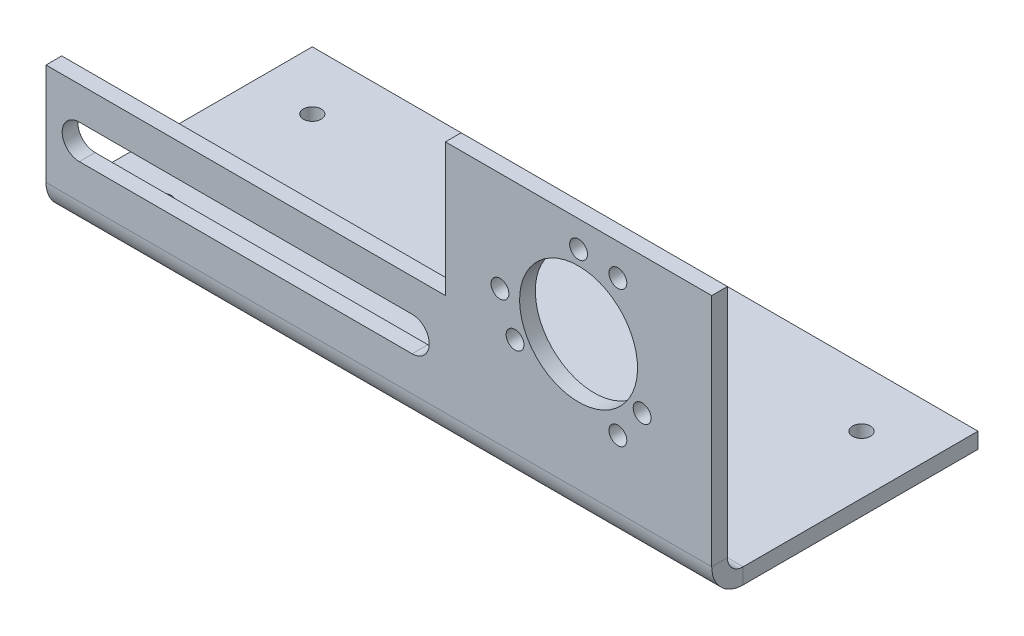
ISO-10303-21;
HEADER;
FILE_DESCRIPTION(('STEP AP214'),'2;1');
FILE_NAME('part.step','',(''),(''),'','','');
FILE_SCHEMA(('AUTOMOTIVE_DESIGN { 1 0 10303 214 1 1 1 1 }'));
ENDSEC;
DATA;
#1=APPLICATION_CONTEXT('core data for automotive mechanical design processes');
#2=APPLICATION_PROTOCOL_DEFINITION('international standard','automotive_design',2000,#1);
#3=PRODUCT_CONTEXT('',#1,'mechanical');
#4=PRODUCT('Part','Part','',(#3));
#5=PRODUCT_RELATED_PRODUCT_CATEGORY('part','',(#4));
#6=PRODUCT_DEFINITION_FORMATION('','',#4);
#7=PRODUCT_DEFINITION_CONTEXT('part definition',#1,'design');
#8=PRODUCT_DEFINITION('design','',#6,#7);
#9=PRODUCT_DEFINITION_SHAPE('','',#8);
#10=(LENGTH_UNIT() NAMED_UNIT(*) SI_UNIT(.MILLI.,.METRE.));
#11=(NAMED_UNIT(*) PLANE_ANGLE_UNIT() SI_UNIT($,.RADIAN.));
#12=(NAMED_UNIT(*) SI_UNIT($,.STERADIAN.) SOLID_ANGLE_UNIT());
#13=UNCERTAINTY_MEASURE_WITH_UNIT(LENGTH_MEASURE(1.E-05),#10,'distance_accuracy_value','');
#14=(GEOMETRIC_REPRESENTATION_CONTEXT(3) GLOBAL_UNCERTAINTY_ASSIGNED_CONTEXT((#13)) GLOBAL_UNIT_ASSIGNED_CONTEXT((#10,
#11,#12)) REPRESENTATION_CONTEXT('',''));
#15=CARTESIAN_POINT('',(0.,0.,0.));
#16=DIRECTION('',(0.,0.,1.));
#17=DIRECTION('',(1.,0.,0.));
#18=AXIS2_PLACEMENT_3D('',#15,#16,#17);
#19=CARTESIAN_POINT('',(0.,0.,0.));
#20=DIRECTION('',(1.,0.,0.));
#21=DIRECTION('',(0.,0.,-1.));
#22=AXIS2_PLACEMENT_3D('',#19,#20,#21);
#23=PLANE('',#22);
#24=DIRECTION('',(0.,-1.,0.));
#25=VECTOR('',#24,1.);
#26=CARTESIAN_POINT('',(0.,0.,0.));
#27=LINE('',#26,#25);
#28=CARTESIAN_POINT('',(0.,22.4,3.26561694352634E-13));
#29=VERTEX_POINT('',#28);
#30=CARTESIAN_POINT('',(0.,2.99999999999999,0.));
#31=VERTEX_POINT('',#30);
#32=EDGE_CURVE('E161',#29,#31,#27,.T.);
#33=ORIENTED_EDGE('',*,*,#32,.F.);
#34=DIRECTION('',(0.,0.,-1.));
#35=VECTOR('',#34,1.);
#36=CARTESIAN_POINT('',(0.,22.4,3.26561694352634E-13));
#37=LINE('',#36,#35);
#38=CARTESIAN_POINT('',(0.,22.4,-3.00000000000002));
#39=VERTEX_POINT('',#38);
#40=EDGE_CURVE('E337',#29,#39,#37,.T.);
#41=ORIENTED_EDGE('',*,*,#40,.T.);
#42=DIRECTION('',(0.,1.,0.));
#43=VECTOR('',#42,1.);
#44=CARTESIAN_POINT('',(0.,0.,-3.00000000000001));
#45=LINE('',#44,#43);
#46=CARTESIAN_POINT('',(0.,3.00000000000003,-3.00000000000001));
#47=VERTEX_POINT('',#46);
#48=EDGE_CURVE('E81',#39,#47,#45,.F.);
#49=ORIENTED_EDGE('',*,*,#48,.T.);
#50=DIRECTION('',(0.,0.,1.));
#51=VECTOR('',#50,1.);
#52=CARTESIAN_POINT('',(0.,3.00000000000003,0.));
#53=LINE('',#52,#51);
#54=EDGE_CURVE('E159',#47,#31,#53,.T.);
#55=ORIENTED_EDGE('',*,*,#54,.T.);
#56=EDGE_LOOP('',(#33,#41,#49,#55));
#57=FACE_BOUND('',#56,.T.);
#58=ADVANCED_FACE('F59',(#57),#23,.F.);
#59=CARTESIAN_POINT('',(127.,47.8000000000001,0.));
#60=DIRECTION('',(-1.,0.,0.));
#61=DIRECTION('',(0.,0.,1.));
#62=AXIS2_PLACEMENT_3D('',#59,#60,#61);
#63=PLANE('',#62);
#64=DIRECTION('',(0.,0.,1.));
#65=VECTOR('',#64,1.);
#66=CARTESIAN_POINT('',(127.,3.00000000000003,-3.));
#67=LINE('',#66,#65);
#68=CARTESIAN_POINT('',(127.,3.00000000000003,-3.00000000000001));
#69=VERTEX_POINT('',#68);
#70=CARTESIAN_POINT('',(127.,3.00000000000003,0.));
#71=VERTEX_POINT('',#70);
#72=EDGE_CURVE('E13',#69,#71,#67,.T.);
#73=ORIENTED_EDGE('',*,*,#72,.F.);
#74=DIRECTION('',(0.,-1.,0.));
#75=VECTOR('',#74,1.);
#76=CARTESIAN_POINT('',(127.,47.8000000000001,-3.00000000000001));
#77=LINE('',#76,#75);
#78=CARTESIAN_POINT('',(127.,47.8000000000001,-3.00000000000001));
#79=VERTEX_POINT('',#78);
#80=EDGE_CURVE('E73',#69,#79,#77,.F.);
#81=ORIENTED_EDGE('',*,*,#80,.T.);
#82=DIRECTION('',(0.,0.,-1.));
#83=VECTOR('',#82,1.);
#84=CARTESIAN_POINT('',(127.,47.8000000000001,0.));
#85=LINE('',#84,#83);
#86=CARTESIAN_POINT('',(127.,47.8000000000001,0.));
#87=VERTEX_POINT('',#86);
#88=EDGE_CURVE('E187',#87,#79,#85,.T.);
#89=ORIENTED_EDGE('',*,*,#88,.F.);
#90=DIRECTION('',(0.,1.,0.));
#91=VECTOR('',#90,1.);
#92=CARTESIAN_POINT('',(127.,0.,0.));
#93=LINE('',#92,#91);
#94=EDGE_CURVE('E176',#71,#87,#93,.T.);
#95=ORIENTED_EDGE('',*,*,#94,.F.);
#96=EDGE_LOOP('',(#73,#81,#89,#95));
#97=FACE_BOUND('',#96,.T.);
#98=ADVANCED_FACE('F386',(#97),#63,.F.);
#99=CARTESIAN_POINT('',(0.,0.,0.));
#100=DIRECTION('',(0.,0.,-1.));
#101=DIRECTION('',(-1.,0.,0.));
#102=AXIS2_PLACEMENT_3D('',#99,#100,#101);
#103=PLANE('',#102);
#104=CARTESIAN_POINT('',(101.6,42.75,0.));
#105=DIRECTION('',(0.,0.,-1.));
#106=DIRECTION('',(0.,1.,0.));
#107=AXIS2_PLACEMENT_3D('',#104,#105,#106);
#108=CIRCLE('',#107,1.69999999999999);
#109=CARTESIAN_POINT('',(101.6,44.45,0.));
#110=VERTEX_POINT('',#109);
#111=EDGE_CURVE('E257',#110,#110,#108,.T.);
#112=ORIENTED_EDGE('',*,*,#111,.T.);
#113=EDGE_LOOP('',(#112));
#114=FACE_BOUND('',#113,.T.);
#115=CARTESIAN_POINT('',(109.1,41.7403810567667,0.));
#116=DIRECTION('',(0.,0.,-1.));
#117=DIRECTION('',(0.,1.,0.));
#118=AXIS2_PLACEMENT_3D('',#115,#116,#117);
#119=CIRCLE('',#118,1.69999999999999);
#120=CARTESIAN_POINT('',(109.1,43.4403810567667,0.));
#121=VERTEX_POINT('',#120);
#122=EDGE_CURVE('E263',#121,#121,#119,.T.);
#123=ORIENTED_EDGE('',*,*,#122,.T.);
#124=EDGE_LOOP('',(#123));
#125=FACE_BOUND('',#124,.T.);
#126=CARTESIAN_POINT('',(89.4756443470179,21.75,0.));
#127=DIRECTION('',(0.,0.,-1.));
#128=DIRECTION('',(0.,1.,0.));
#129=AXIS2_PLACEMENT_3D('',#126,#127,#128);
#130=CIRCLE('',#129,1.69999999999999);
#131=CARTESIAN_POINT('',(89.4756443470179,23.45,0.));
#132=VERTEX_POINT('',#131);
#133=EDGE_CURVE('E269',#132,#132,#130,.T.);
#134=ORIENTED_EDGE('',*,*,#133,.T.);
#135=EDGE_LOOP('',(#134));
#136=FACE_BOUND('',#135,.T.);
#137=CARTESIAN_POINT('',(86.6,28.7500000000001,0.));
#138=DIRECTION('',(0.,0.,-1.));
#139=DIRECTION('',(0.,1.,0.));
#140=AXIS2_PLACEMENT_3D('',#137,#138,#139);
#141=CIRCLE('',#140,1.69999999999999);
#142=CARTESIAN_POINT('',(86.6,30.4500000000001,0.));
#143=VERTEX_POINT('',#142);
#144=EDGE_CURVE('E275',#143,#143,#141,.T.);
#145=ORIENTED_EDGE('',*,*,#144,.T.);
#146=EDGE_LOOP('',(#145));
#147=FACE_BOUND('',#146,.T.);
#148=CARTESIAN_POINT('',(113.724355652982,21.7500000000002,0.));
#149=DIRECTION('',(0.,0.,-1.));
#150=DIRECTION('',(0.,1.,0.));
#151=AXIS2_PLACEMENT_3D('',#148,#149,#150);
#152=CIRCLE('',#151,1.69999999999999);
#153=CARTESIAN_POINT('',(113.724355652982,23.4500000000002,0.));
#154=VERTEX_POINT('',#153);
#155=EDGE_CURVE('E281',#154,#154,#152,.T.);
#156=ORIENTED_EDGE('',*,*,#155,.T.);
#157=EDGE_LOOP('',(#156));
#158=FACE_BOUND('',#157,.T.);
#159=CARTESIAN_POINT('',(109.1,15.7596189432335,0.));
#160=DIRECTION('',(0.,0.,-1.));
#161=DIRECTION('',(0.,1.,0.));
#162=AXIS2_PLACEMENT_3D('',#159,#160,#161);
#163=CIRCLE('',#162,1.69999999999999);
#164=CARTESIAN_POINT('',(109.1,17.4596189432335,0.));
#165=VERTEX_POINT('',#164);
#166=EDGE_CURVE('E287',#165,#165,#163,.T.);
#167=ORIENTED_EDGE('',*,*,#166,.T.);
#168=EDGE_LOOP('',(#167));
#169=FACE_BOUND('',#168,.T.);
#170=CARTESIAN_POINT('',(101.6,28.75,3.26561694352634E-13));
#171=DIRECTION('',(0.,0.,-1.));
#172=DIRECTION('',(0.,1.,0.));
#173=AXIS2_PLACEMENT_3D('',#170,#171,#172);
#174=CIRCLE('',#173,11.25);
#175=CARTESIAN_POINT('',(101.6,40.,3.26561694352634E-13));
#176=VERTEX_POINT('',#175);
#177=EDGE_CURVE('E308',#176,#176,#174,.T.);
#178=ORIENTED_EDGE('',*,*,#177,.T.);
#179=EDGE_LOOP('',(#178));
#180=FACE_BOUND('',#179,.T.);
#181=DIRECTION('',(-1.,0.,0.));
#182=VECTOR('',#181,1.);
#183=CARTESIAN_POINT('',(6.35,9.61110000000005,3.26561694352634E-13));
#184=LINE('',#183,#182);
#185=CARTESIAN_POINT('',(69.85,9.61110000000005,3.26561694352634E-13));
#186=VERTEX_POINT('',#185);
#187=CARTESIAN_POINT('',(6.35,9.61110000000005,3.26561694352634E-13));
#188=VERTEX_POINT('',#187);
#189=EDGE_CURVE('E301',#186,#188,#184,.T.);
#190=ORIENTED_EDGE('',*,*,#189,.T.);
#191=CARTESIAN_POINT('',(6.35,12.875,3.26561694352634E-13));
#192=DIRECTION('',(0.,0.,-1.));
#193=DIRECTION('',(0.,1.,0.));
#194=AXIS2_PLACEMENT_3D('',#191,#192,#193);
#195=CIRCLE('',#194,3.2639);
#196=CARTESIAN_POINT('',(6.35,16.1389,3.26561694352634E-13));
#197=VERTEX_POINT('',#196);
#198=EDGE_CURVE('E291',#188,#197,#195,.T.);
#199=ORIENTED_EDGE('',*,*,#198,.T.);
#200=DIRECTION('',(1.,0.,0.));
#201=VECTOR('',#200,1.);
#202=CARTESIAN_POINT('',(6.35,16.1389,3.26561694352634E-13));
#203=LINE('',#202,#201);
#204=CARTESIAN_POINT('',(69.85,16.1389,0.));
#205=VERTEX_POINT('',#204);
#206=EDGE_CURVE('E294',#197,#205,#203,.T.);
#207=ORIENTED_EDGE('',*,*,#206,.T.);
#208=CARTESIAN_POINT('',(69.85,12.875,3.26561694352634E-13));
#209=DIRECTION('',(0.,0.,-1.));
#210=DIRECTION('',(0.,1.,0.));
#211=AXIS2_PLACEMENT_3D('',#208,#209,#210);
#212=CIRCLE('',#211,3.2639);
#213=EDGE_CURVE('E298',#205,#186,#212,.T.);
#214=ORIENTED_EDGE('',*,*,#213,.T.);
#215=EDGE_LOOP('',(#190,#199,#207,#214));
#216=FACE_BOUND('',#215,.T.);
#217=DIRECTION('',(0.,-1.,0.));
#218=VECTOR('',#217,1.);
#219=CARTESIAN_POINT('',(76.2,47.8000000000001,3.26561694352634E-13));
#220=LINE('',#219,#218);
#221=CARTESIAN_POINT('',(76.2,47.8000000000001,0.));
#222=VERTEX_POINT('',#221);
#223=CARTESIAN_POINT('',(76.2,22.4,3.26561694352634E-13));
#224=VERTEX_POINT('',#223);
#225=EDGE_CURVE('E329',#222,#224,#220,.T.);
#226=ORIENTED_EDGE('',*,*,#225,.T.);
#227=DIRECTION('',(-1.,0.,0.));
#228=VECTOR('',#227,1.);
#229=CARTESIAN_POINT('',(0.,22.4,3.26561694352634E-13));
#230=LINE('',#229,#228);
#231=EDGE_CURVE('E175',#224,#29,#230,.T.);
#232=ORIENTED_EDGE('',*,*,#231,.T.);
#233=ORIENTED_EDGE('',*,*,#32,.T.);
#234=DIRECTION('',(-1.,0.,0.));
#235=VECTOR('',#234,1.);
#236=CARTESIAN_POINT('',(0.,3.00000000000003,0.));
#237=LINE('',#236,#235);
#238=EDGE_CURVE('E166',#71,#31,#237,.T.);
#239=ORIENTED_EDGE('',*,*,#238,.F.);
#240=ORIENTED_EDGE('',*,*,#94,.T.);
#241=DIRECTION('',(-1.,0.,0.));
#242=VECTOR('',#241,1.);
#243=CARTESIAN_POINT('',(0.,47.8000000000001,0.));
#244=LINE('',#243,#242);
#245=EDGE_CURVE('E344',#87,#222,#244,.T.);
#246=ORIENTED_EDGE('',*,*,#245,.T.);
#247=EDGE_LOOP('',(#226,#232,#233,#239,#240,#246));
#248=FACE_BOUND('',#247,.T.);
#249=ADVANCED_FACE('F172',(#114,#125,#136,#147,#158,#169,#180,#216,#248),#103,.F.);
#250=CARTESIAN_POINT('',(0.,0.,-3.00000000000001));
#251=DIRECTION('',(0.,0.,-1.));
#252=DIRECTION('',(-1.,0.,0.));
#253=AXIS2_PLACEMENT_3D('',#250,#251,#252);
#254=PLANE('',#253);
#255=CARTESIAN_POINT('',(101.6,42.75,-3.00000000000002));
#256=DIRECTION('',(0.,0.,-1.));
#257=DIRECTION('',(0.,1.,0.));
#258=AXIS2_PLACEMENT_3D('',#255,#256,#257);
#259=CIRCLE('',#258,1.69999999999999);
#260=CARTESIAN_POINT('',(101.6,44.45,-3.00000000000002));
#261=VERTEX_POINT('',#260);
#262=EDGE_CURVE('E205',#261,#261,#259,.T.);
#263=ORIENTED_EDGE('',*,*,#262,.F.);
#264=EDGE_LOOP('',(#263));
#265=FACE_BOUND('',#264,.T.);
#266=CARTESIAN_POINT('',(109.1,41.7403810567667,-3.00000000000002));
#267=DIRECTION('',(0.,0.,-1.));
#268=DIRECTION('',(0.,1.,0.));
#269=AXIS2_PLACEMENT_3D('',#266,#267,#268);
#270=CIRCLE('',#269,1.69999999999999);
#271=CARTESIAN_POINT('',(109.1,43.4403810567667,-3.00000000000002));
#272=VERTEX_POINT('',#271);
#273=EDGE_CURVE('E260',#272,#272,#270,.T.);
#274=ORIENTED_EDGE('',*,*,#273,.F.);
#275=EDGE_LOOP('',(#274));
#276=FACE_BOUND('',#275,.T.);
#277=CARTESIAN_POINT('',(89.4756443470179,21.75,-3.00000000000002));
#278=DIRECTION('',(0.,0.,-1.));
#279=DIRECTION('',(0.,1.,0.));
#280=AXIS2_PLACEMENT_3D('',#277,#278,#279);
#281=CIRCLE('',#280,1.69999999999999);
#282=CARTESIAN_POINT('',(89.4756443470179,23.45,-3.00000000000002));
#283=VERTEX_POINT('',#282);
#284=EDGE_CURVE('E266',#283,#283,#281,.T.);
#285=ORIENTED_EDGE('',*,*,#284,.F.);
#286=EDGE_LOOP('',(#285));
#287=FACE_BOUND('',#286,.T.);
#288=CARTESIAN_POINT('',(86.6,28.7500000000001,-3.00000000000002));
#289=DIRECTION('',(0.,0.,-1.));
#290=DIRECTION('',(0.,1.,0.));
#291=AXIS2_PLACEMENT_3D('',#288,#289,#290);
#292=CIRCLE('',#291,1.69999999999999);
#293=CARTESIAN_POINT('',(86.6,30.4500000000001,-3.00000000000002));
#294=VERTEX_POINT('',#293);
#295=EDGE_CURVE('E272',#294,#294,#292,.T.);
#296=ORIENTED_EDGE('',*,*,#295,.F.);
#297=EDGE_LOOP('',(#296));
#298=FACE_BOUND('',#297,.T.);
#299=CARTESIAN_POINT('',(113.724355652982,21.7500000000002,-3.00000000000002));
#300=DIRECTION('',(0.,0.,-1.));
#301=DIRECTION('',(0.,1.,0.));
#302=AXIS2_PLACEMENT_3D('',#299,#300,#301);
#303=CIRCLE('',#302,1.69999999999999);
#304=CARTESIAN_POINT('',(113.724355652982,23.4500000000002,-3.00000000000002));
#305=VERTEX_POINT('',#304);
#306=EDGE_CURVE('E278',#305,#305,#303,.T.);
#307=ORIENTED_EDGE('',*,*,#306,.F.);
#308=EDGE_LOOP('',(#307));
#309=FACE_BOUND('',#308,.T.);
#310=CARTESIAN_POINT('',(109.1,15.7596189432335,-3.00000000000002));
#311=DIRECTION('',(0.,0.,-1.));
#312=DIRECTION('',(0.,1.,0.));
#313=AXIS2_PLACEMENT_3D('',#310,#311,#312);
#314=CIRCLE('',#313,1.69999999999999);
#315=CARTESIAN_POINT('',(109.1,17.4596189432335,-3.00000000000002));
#316=VERTEX_POINT('',#315);
#317=EDGE_CURVE('E284',#316,#316,#314,.T.);
#318=ORIENTED_EDGE('',*,*,#317,.F.);
#319=EDGE_LOOP('',(#318));
#320=FACE_BOUND('',#319,.T.);
#321=CARTESIAN_POINT('',(101.6,28.75,-3.00000000000002));
#322=DIRECTION('',(0.,0.,-1.));
#323=DIRECTION('',(0.,1.,0.));
#324=AXIS2_PLACEMENT_3D('',#321,#322,#323);
#325=CIRCLE('',#324,11.25);
#326=CARTESIAN_POINT('',(101.6,40.,-3.00000000000002));
#327=VERTEX_POINT('',#326);
#328=EDGE_CURVE('E290',#327,#327,#325,.T.);
#329=ORIENTED_EDGE('',*,*,#328,.F.);
#330=EDGE_LOOP('',(#329));
#331=FACE_BOUND('',#330,.T.);
#332=CARTESIAN_POINT('',(6.35,12.875,-3.00000000000002));
#333=DIRECTION('',(0.,0.,-1.));
#334=DIRECTION('',(0.,1.,0.));
#335=AXIS2_PLACEMENT_3D('',#332,#333,#334);
#336=CIRCLE('',#335,3.2639);
#337=CARTESIAN_POINT('',(6.35,9.61110000000005,-3.00000000000002));
#338=VERTEX_POINT('',#337);
#339=CARTESIAN_POINT('',(6.35,16.1389,-3.00000000000001));
#340=VERTEX_POINT('',#339);
#341=EDGE_CURVE('E305',#338,#340,#336,.T.);
#342=ORIENTED_EDGE('',*,*,#341,.F.);
#343=DIRECTION('',(-1.,0.,0.));
#344=VECTOR('',#343,1.);
#345=CARTESIAN_POINT('',(6.35,9.61110000000005,-3.00000000000002));
#346=LINE('',#345,#344);
#347=CARTESIAN_POINT('',(69.85,9.61110000000005,-3.00000000000002));
#348=VERTEX_POINT('',#347);
#349=EDGE_CURVE('E295',#348,#338,#346,.T.);
#350=ORIENTED_EDGE('',*,*,#349,.F.);
#351=CARTESIAN_POINT('',(69.85,12.875,-3.00000000000002));
#352=DIRECTION('',(0.,0.,-1.));
#353=DIRECTION('',(0.,1.,0.));
#354=AXIS2_PLACEMENT_3D('',#351,#352,#353);
#355=CIRCLE('',#354,3.2639);
#356=CARTESIAN_POINT('',(69.85,16.1389,-3.00000000000002));
#357=VERTEX_POINT('',#356);
#358=EDGE_CURVE('E311',#357,#348,#355,.T.);
#359=ORIENTED_EDGE('',*,*,#358,.F.);
#360=DIRECTION('',(1.,0.,0.));
#361=VECTOR('',#360,1.);
#362=CARTESIAN_POINT('',(6.35,16.1389,-3.00000000000002));
#363=LINE('',#362,#361);
#364=EDGE_CURVE('E307',#340,#357,#363,.T.);
#365=ORIENTED_EDGE('',*,*,#364,.F.);
#366=EDGE_LOOP('',(#342,#350,#359,#365));
#367=FACE_BOUND('',#366,.T.);
#368=DIRECTION('',(-1.,0.,0.));
#369=VECTOR('',#368,1.);
#370=CARTESIAN_POINT('',(0.,22.4,-3.00000000000002));
#371=LINE('',#370,#369);
#372=CARTESIAN_POINT('',(76.2,22.4,-3.00000000000002));
#373=VERTEX_POINT('',#372);
#374=EDGE_CURVE('E331',#373,#39,#371,.T.);
#375=ORIENTED_EDGE('',*,*,#374,.F.);
#376=DIRECTION('',(0.,-1.,0.));
#377=VECTOR('',#376,1.);
#378=CARTESIAN_POINT('',(76.2,47.8000000000001,-3.00000000000002));
#379=LINE('',#378,#377);
#380=CARTESIAN_POINT('',(76.2,47.8000000000001,-3.00000000000002));
#381=VERTEX_POINT('',#380);
#382=EDGE_CURVE('E318',#381,#373,#379,.T.);
#383=ORIENTED_EDGE('',*,*,#382,.F.);
#384=DIRECTION('',(1.,0.,0.));
#385=VECTOR('',#384,1.);
#386=CARTESIAN_POINT('',(0.,47.8000000000001,-3.00000000000001));
#387=LINE('',#386,#385);
#388=EDGE_CURVE('E177',#79,#381,#387,.F.);
#389=ORIENTED_EDGE('',*,*,#388,.F.);
#390=ORIENTED_EDGE('',*,*,#80,.F.);
#391=DIRECTION('',(1.,0.,0.));
#392=VECTOR('',#391,1.);
#393=CARTESIAN_POINT('',(0.,3.00000000000003,-3.));
#394=LINE('',#393,#392);
#395=EDGE_CURVE('E66',#47,#69,#394,.T.);
#396=ORIENTED_EDGE('',*,*,#395,.F.);
#397=ORIENTED_EDGE('',*,*,#48,.F.);
#398=EDGE_LOOP('',(#375,#383,#389,#390,#396,#397));
#399=FACE_BOUND('',#398,.T.);
#400=ADVANCED_FACE('F394',(#265,#276,#287,#298,#309,#320,#331,#367,#399),#254,.T.);
#401=CARTESIAN_POINT('',(0.,47.8000000000001,0.));
#402=DIRECTION('',(0.,-1.,0.));
#403=DIRECTION('',(0.,0.,-1.));
#404=AXIS2_PLACEMENT_3D('',#401,#402,#403);
#405=PLANE('',#404);
#406=ORIENTED_EDGE('',*,*,#388,.T.);
#407=DIRECTION('',(0.,0.,-1.));
#408=VECTOR('',#407,1.);
#409=CARTESIAN_POINT('',(76.2,47.8000000000001,3.26561694352634E-13));
#410=LINE('',#409,#408);
#411=EDGE_CURVE('E333',#222,#381,#410,.T.);
#412=ORIENTED_EDGE('',*,*,#411,.F.);
#413=ORIENTED_EDGE('',*,*,#245,.F.);
#414=ORIENTED_EDGE('',*,*,#88,.T.);
#415=EDGE_LOOP('',(#406,#412,#413,#414));
#416=FACE_BOUND('',#415,.T.);
#417=ADVANCED_FACE('F398',(#416),#405,.F.);
#418=CARTESIAN_POINT('',(0.,22.4,3.26561694352634E-13));
#419=DIRECTION('',(0.,-1.,0.));
#420=DIRECTION('',(0.,0.,-1.));
#421=AXIS2_PLACEMENT_3D('',#418,#419,#420);
#422=PLANE('',#421);
#423=ORIENTED_EDGE('',*,*,#374,.T.);
#424=ORIENTED_EDGE('',*,*,#40,.F.);
#425=ORIENTED_EDGE('',*,*,#231,.F.);
#426=DIRECTION('',(0.,0.,-1.));
#427=VECTOR('',#426,1.);
#428=CARTESIAN_POINT('',(76.2,22.4,3.26561694352634E-13));
#429=LINE('',#428,#427);
#430=EDGE_CURVE('E339',#224,#373,#429,.T.);
#431=ORIENTED_EDGE('',*,*,#430,.T.);
#432=EDGE_LOOP('',(#423,#424,#425,#431));
#433=FACE_BOUND('',#432,.T.);
#434=ADVANCED_FACE('F401',(#433),#422,.F.);
#435=CARTESIAN_POINT('',(76.2,47.8000000000001,3.26561694352634E-13));
#436=DIRECTION('',(1.,0.,0.));
#437=DIRECTION('',(0.,-1.,0.));
#438=AXIS2_PLACEMENT_3D('',#435,#436,#437);
#439=PLANE('',#438);
#440=ORIENTED_EDGE('',*,*,#382,.T.);
#441=ORIENTED_EDGE('',*,*,#430,.F.);
#442=ORIENTED_EDGE('',*,*,#225,.F.);
#443=ORIENTED_EDGE('',*,*,#411,.T.);
#444=EDGE_LOOP('',(#440,#441,#442,#443));
#445=FACE_BOUND('',#444,.T.);
#446=ADVANCED_FACE('F406',(#445),#439,.F.);
#447=CARTESIAN_POINT('',(6.35,12.875,3.26561694352634E-13));
#448=DIRECTION('',(0.,0.,-1.));
#449=DIRECTION('',(0.,1.,0.));
#450=AXIS2_PLACEMENT_3D('',#447,#448,#449);
#451=CYLINDRICAL_SURFACE('',#450,3.2639);
#452=ORIENTED_EDGE('',*,*,#341,.T.);
#453=DIRECTION('',(0.,0.,-1.));
#454=VECTOR('',#453,1.);
#455=CARTESIAN_POINT('',(6.35,16.1389,3.26561694352634E-13));
#456=LINE('',#455,#454);
#457=EDGE_CURVE('E304',#197,#340,#456,.T.);
#458=ORIENTED_EDGE('',*,*,#457,.F.);
#459=ORIENTED_EDGE('',*,*,#198,.F.);
#460=DIRECTION('',(0.,0.,-1.));
#461=VECTOR('',#460,1.);
#462=CARTESIAN_POINT('',(6.35,9.61110000000005,3.26561694352634E-13));
#463=LINE('',#462,#461);
#464=EDGE_CURVE('E316',#188,#338,#463,.T.);
#465=ORIENTED_EDGE('',*,*,#464,.T.);
#466=EDGE_LOOP('',(#452,#458,#459,#465));
#467=FACE_BOUND('',#466,.T.);
#468=ADVANCED_FACE('F409',(#467),#451,.F.);
#469=CARTESIAN_POINT('',(6.35,9.61110000000005,3.26561694352634E-13));
#470=DIRECTION('',(0.,-1.,0.));
#471=DIRECTION('',(0.,0.,-1.));
#472=AXIS2_PLACEMENT_3D('',#469,#470,#471);
#473=PLANE('',#472);
#474=ORIENTED_EDGE('',*,*,#349,.T.);
#475=ORIENTED_EDGE('',*,*,#464,.F.);
#476=ORIENTED_EDGE('',*,*,#189,.F.);
#477=DIRECTION('',(0.,0.,-1.));
#478=VECTOR('',#477,1.);
#479=CARTESIAN_POINT('',(69.85,9.61110000000005,3.26561694352634E-13));
#480=LINE('',#479,#478);
#481=EDGE_CURVE('E319',#186,#348,#480,.T.);
#482=ORIENTED_EDGE('',*,*,#481,.T.);
#483=EDGE_LOOP('',(#474,#475,#476,#482));
#484=FACE_BOUND('',#483,.T.);
#485=ADVANCED_FACE('F422',(#484),#473,.F.);
#486=CARTESIAN_POINT('',(69.85,12.875,3.26561694352634E-13));
#487=DIRECTION('',(0.,0.,-1.));
#488=DIRECTION('',(0.,1.,0.));
#489=AXIS2_PLACEMENT_3D('',#486,#487,#488);
#490=CYLINDRICAL_SURFACE('',#489,3.2639);
#491=ORIENTED_EDGE('',*,*,#358,.T.);
#492=ORIENTED_EDGE('',*,*,#481,.F.);
#493=ORIENTED_EDGE('',*,*,#213,.F.);
#494=DIRECTION('',(0.,0.,-1.));
#495=VECTOR('',#494,1.);
#496=CARTESIAN_POINT('',(69.85,16.1389,3.26561694352634E-13));
#497=LINE('',#496,#495);
#498=EDGE_CURVE('E321',#205,#357,#497,.T.);
#499=ORIENTED_EDGE('',*,*,#498,.T.);
#500=EDGE_LOOP('',(#491,#492,#493,#499));
#501=FACE_BOUND('',#500,.T.);
#502=ADVANCED_FACE('F426',(#501),#490,.F.);
#503=CARTESIAN_POINT('',(6.35,16.1389,3.26561694352634E-13));
#504=DIRECTION('',(0.,1.,0.));
#505=DIRECTION('',(0.,0.,1.));
#506=AXIS2_PLACEMENT_3D('',#503,#504,#505);
#507=PLANE('',#506);
#508=ORIENTED_EDGE('',*,*,#364,.T.);
#509=ORIENTED_EDGE('',*,*,#498,.F.);
#510=ORIENTED_EDGE('',*,*,#206,.F.);
#511=ORIENTED_EDGE('',*,*,#457,.T.);
#512=EDGE_LOOP('',(#508,#509,#510,#511));
#513=FACE_BOUND('',#512,.T.);
#514=ADVANCED_FACE('F418',(#513),#507,.F.);
#515=CARTESIAN_POINT('',(101.6,28.75,3.26561694352634E-13));
#516=DIRECTION('',(0.,0.,-1.));
#517=DIRECTION('',(0.,1.,0.));
#518=AXIS2_PLACEMENT_3D('',#515,#516,#517);
#519=CYLINDRICAL_SURFACE('',#518,11.25);
#520=ORIENTED_EDGE('',*,*,#177,.F.);
#521=EDGE_LOOP('',(#520));
#522=FACE_BOUND('',#521,.T.);
#523=ORIENTED_EDGE('',*,*,#328,.T.);
#524=EDGE_LOOP('',(#523));
#525=FACE_BOUND('',#524,.T.);
#526=ADVANCED_FACE('F414',(#522,#525),#519,.F.);
#527=CARTESIAN_POINT('',(109.1,15.7596189432335,-3.00000000000002));
#528=DIRECTION('',(0.,0.,-1.));
#529=DIRECTION('',(0.,1.,0.));
#530=AXIS2_PLACEMENT_3D('',#527,#528,#529);
#531=CYLINDRICAL_SURFACE('',#530,1.69999999999999);
#532=ORIENTED_EDGE('',*,*,#317,.T.);
#533=EDGE_LOOP('',(#532));
#534=FACE_BOUND('',#533,.T.);
#535=ORIENTED_EDGE('',*,*,#166,.F.);
#536=EDGE_LOOP('',(#535));
#537=FACE_BOUND('',#536,.T.);
#538=ADVANCED_FACE('F417',(#534,#537),#531,.F.);
#539=CARTESIAN_POINT('',(113.724355652982,21.7500000000002,-3.00000000000002));
#540=DIRECTION('',(0.,0.,-1.));
#541=DIRECTION('',(0.,1.,0.));
#542=AXIS2_PLACEMENT_3D('',#539,#540,#541);
#543=CYLINDRICAL_SURFACE('',#542,1.69999999999999);
#544=ORIENTED_EDGE('',*,*,#306,.T.);
#545=EDGE_LOOP('',(#544));
#546=FACE_BOUND('',#545,.T.);
#547=ORIENTED_EDGE('',*,*,#155,.F.);
#548=EDGE_LOOP('',(#547));
#549=FACE_BOUND('',#548,.T.);
#550=ADVANCED_FACE('F436',(#546,#549),#543,.F.);
#551=CARTESIAN_POINT('',(86.6,28.7500000000001,-3.00000000000002));
#552=DIRECTION('',(0.,0.,-1.));
#553=DIRECTION('',(0.,1.,0.));
#554=AXIS2_PLACEMENT_3D('',#551,#552,#553);
#555=CYLINDRICAL_SURFACE('',#554,1.69999999999999);
#556=ORIENTED_EDGE('',*,*,#295,.T.);
#557=EDGE_LOOP('',(#556));
#558=FACE_BOUND('',#557,.T.);
#559=ORIENTED_EDGE('',*,*,#144,.F.);
#560=EDGE_LOOP('',(#559));
#561=FACE_BOUND('',#560,.T.);
#562=ADVANCED_FACE('F440',(#558,#561),#555,.F.);
#563=CARTESIAN_POINT('',(89.4756443470179,21.75,-3.00000000000002));
#564=DIRECTION('',(0.,0.,-1.));
#565=DIRECTION('',(0.,1.,0.));
#566=AXIS2_PLACEMENT_3D('',#563,#564,#565);
#567=CYLINDRICAL_SURFACE('',#566,1.69999999999999);
#568=ORIENTED_EDGE('',*,*,#284,.T.);
#569=EDGE_LOOP('',(#568));
#570=FACE_BOUND('',#569,.T.);
#571=ORIENTED_EDGE('',*,*,#133,.F.);
#572=EDGE_LOOP('',(#571));
#573=FACE_BOUND('',#572,.T.);
#574=ADVANCED_FACE('F444',(#570,#573),#567,.F.);
#575=CARTESIAN_POINT('',(109.1,41.7403810567667,-3.00000000000002));
#576=DIRECTION('',(0.,0.,-1.));
#577=DIRECTION('',(0.,1.,0.));
#578=AXIS2_PLACEMENT_3D('',#575,#576,#577);
#579=CYLINDRICAL_SURFACE('',#578,1.69999999999999);
#580=ORIENTED_EDGE('',*,*,#273,.T.);
#581=EDGE_LOOP('',(#580));
#582=FACE_BOUND('',#581,.T.);
#583=ORIENTED_EDGE('',*,*,#122,.F.);
#584=EDGE_LOOP('',(#583));
#585=FACE_BOUND('',#584,.T.);
#586=ADVANCED_FACE('F448',(#582,#585),#579,.F.);
#587=CARTESIAN_POINT('',(101.6,42.75,-3.00000000000002));
#588=DIRECTION('',(0.,0.,-1.));
#589=DIRECTION('',(0.,1.,0.));
#590=AXIS2_PLACEMENT_3D('',#587,#588,#589);
#591=CYLINDRICAL_SURFACE('',#590,1.69999999999999);
#592=ORIENTED_EDGE('',*,*,#262,.T.);
#593=EDGE_LOOP('',(#592));
#594=FACE_BOUND('',#593,.T.);
#595=ORIENTED_EDGE('',*,*,#111,.F.);
#596=EDGE_LOOP('',(#595));
#597=FACE_BOUND('',#596,.T.);
#598=ADVANCED_FACE('F452',(#594,#597),#591,.F.);
#599=CARTESIAN_POINT('',(0.,-3.,-50.8));
#600=DIRECTION('',(0.,0.,-1.));
#601=DIRECTION('',(-1.,0.,0.));
#602=AXIS2_PLACEMENT_3D('',#599,#600,#601);
#603=PLANE('',#602);
#604=DIRECTION('',(-1.,0.,0.));
#605=VECTOR('',#604,1.);
#606=CARTESIAN_POINT('',(0.,0.,-50.8));
#607=LINE('',#606,#605);
#608=CARTESIAN_POINT('',(127.,0.,-50.8));
#609=VERTEX_POINT('',#608);
#610=CARTESIAN_POINT('',(0.,0.,-50.8));
#611=VERTEX_POINT('',#610);
#612=EDGE_CURVE('E213',#609,#611,#607,.T.);
#613=ORIENTED_EDGE('',*,*,#612,.F.);
#614=DIRECTION('',(0.,1.,0.));
#615=VECTOR('',#614,1.);
#616=CARTESIAN_POINT('',(127.,-3.,-50.8));
#617=LINE('',#616,#615);
#618=CARTESIAN_POINT('',(127.,-3.,-50.8));
#619=VERTEX_POINT('',#618);
#620=EDGE_CURVE('E202',#619,#609,#617,.T.);
#621=ORIENTED_EDGE('',*,*,#620,.F.);
#622=DIRECTION('',(-1.,0.,0.));
#623=VECTOR('',#622,1.);
#624=CARTESIAN_POINT('',(0.,-3.,-50.8));
#625=LINE('',#624,#623);
#626=CARTESIAN_POINT('',(0.,-3.,-50.8));
#627=VERTEX_POINT('',#626);
#628=EDGE_CURVE('E249',#619,#627,#625,.T.);
#629=ORIENTED_EDGE('',*,*,#628,.T.);
#630=DIRECTION('',(0.,1.,0.));
#631=VECTOR('',#630,1.);
#632=CARTESIAN_POINT('',(0.,-3.,-50.8));
#633=LINE('',#632,#631);
#634=EDGE_CURVE('E247',#627,#611,#633,.T.);
#635=ORIENTED_EDGE('',*,*,#634,.T.);
#636=EDGE_LOOP('',(#613,#621,#629,#635));
#637=FACE_BOUND('',#636,.T.);
#638=ADVANCED_FACE('F371',(#637),#603,.T.);
#639=CARTESIAN_POINT('',(11.1125000000001,0.,-11.1125));
#640=DIRECTION('',(0.,1.,0.));
#641=DIRECTION('',(0.,0.,1.));
#642=AXIS2_PLACEMENT_3D('',#639,#640,#641);
#643=CYLINDRICAL_SURFACE('',#642,1.69999999999999);
#644=CARTESIAN_POINT('',(11.1125000000001,-3.,-11.1125));
#645=DIRECTION('',(0.,-1.,0.));
#646=DIRECTION('',(0.,0.,-1.));
#647=AXIS2_PLACEMENT_3D('',#644,#645,#646);
#648=CIRCLE('',#647,1.69999999999999);
#649=CARTESIAN_POINT('',(11.1125000000001,-3.,-12.8125));
#650=VERTEX_POINT('',#649);
#651=EDGE_CURVE('E244',#650,#650,#648,.T.);
#652=ORIENTED_EDGE('',*,*,#651,.T.);
#653=EDGE_LOOP('',(#652));
#654=FACE_BOUND('',#653,.T.);
#655=CARTESIAN_POINT('',(11.1125000000001,0.,-11.1125));
#656=DIRECTION('',(0.,1.,0.));
#657=DIRECTION('',(0.,0.,1.));
#658=AXIS2_PLACEMENT_3D('',#655,#656,#657);
#659=CIRCLE('',#658,1.69999999999999);
#660=CARTESIAN_POINT('',(11.1125000000001,0.,-9.41250000000001));
#661=VERTEX_POINT('',#660);
#662=EDGE_CURVE('E241',#661,#661,#659,.T.);
#663=ORIENTED_EDGE('',*,*,#662,.T.);
#664=EDGE_LOOP('',(#663));
#665=FACE_BOUND('',#664,.T.);
#666=ADVANCED_FACE('F459',(#654,#665),#643,.F.);
#667=CARTESIAN_POINT('',(115.8875,0.,-11.1125));
#668=DIRECTION('',(0.,1.,0.));
#669=DIRECTION('',(0.,0.,1.));
#670=AXIS2_PLACEMENT_3D('',#667,#668,#669);
#671=CYLINDRICAL_SURFACE('',#670,1.69999999999999);
#672=CARTESIAN_POINT('',(115.8875,-3.,-11.1125));
#673=DIRECTION('',(0.,-1.,0.));
#674=DIRECTION('',(0.,0.,-1.));
#675=AXIS2_PLACEMENT_3D('',#672,#673,#674);
#676=CIRCLE('',#675,1.69999999999999);
#677=CARTESIAN_POINT('',(115.8875,-3.,-12.8125));
#678=VERTEX_POINT('',#677);
#679=EDGE_CURVE('E238',#678,#678,#676,.T.);
#680=ORIENTED_EDGE('',*,*,#679,.T.);
#681=EDGE_LOOP('',(#680));
#682=FACE_BOUND('',#681,.T.);
#683=CARTESIAN_POINT('',(115.8875,0.,-11.1125));
#684=DIRECTION('',(0.,1.,0.));
#685=DIRECTION('',(0.,0.,1.));
#686=AXIS2_PLACEMENT_3D('',#683,#684,#685);
#687=CIRCLE('',#686,1.69999999999999);
#688=CARTESIAN_POINT('',(115.8875,0.,-9.41250000000001));
#689=VERTEX_POINT('',#688);
#690=EDGE_CURVE('E235',#689,#689,#687,.T.);
#691=ORIENTED_EDGE('',*,*,#690,.T.);
#692=EDGE_LOOP('',(#691));
#693=FACE_BOUND('',#692,.T.);
#694=ADVANCED_FACE('F512',(#682,#693),#671,.F.);
#695=CARTESIAN_POINT('',(115.8875,0.,-39.6875));
#696=DIRECTION('',(0.,1.,0.));
#697=DIRECTION('',(0.,0.,1.));
#698=AXIS2_PLACEMENT_3D('',#695,#696,#697);
#699=CYLINDRICAL_SURFACE('',#698,1.69999999999999);
#700=CARTESIAN_POINT('',(115.8875,-3.,-39.6875));
#701=DIRECTION('',(0.,-1.,0.));
#702=DIRECTION('',(0.,0.,-1.));
#703=AXIS2_PLACEMENT_3D('',#700,#701,#702);
#704=CIRCLE('',#703,1.69999999999999);
#705=CARTESIAN_POINT('',(115.8875,-3.,-41.3875));
#706=VERTEX_POINT('',#705);
#707=EDGE_CURVE('E232',#706,#706,#704,.T.);
#708=ORIENTED_EDGE('',*,*,#707,.T.);
#709=EDGE_LOOP('',(#708));
#710=FACE_BOUND('',#709,.T.);
#711=CARTESIAN_POINT('',(115.8875,0.,-39.6875));
#712=DIRECTION('',(0.,1.,0.));
#713=DIRECTION('',(0.,0.,1.));
#714=AXIS2_PLACEMENT_3D('',#711,#712,#713);
#715=CIRCLE('',#714,1.69999999999999);
#716=CARTESIAN_POINT('',(115.8875,0.,-37.9875));
#717=VERTEX_POINT('',#716);
#718=EDGE_CURVE('E229',#717,#717,#715,.T.);
#719=ORIENTED_EDGE('',*,*,#718,.T.);
#720=EDGE_LOOP('',(#719));
#721=FACE_BOUND('',#720,.T.);
#722=ADVANCED_FACE('F520',(#710,#721),#699,.F.);
#723=CARTESIAN_POINT('',(11.1125000000001,0.,-39.6875));
#724=DIRECTION('',(0.,1.,0.));
#725=DIRECTION('',(0.,0.,1.));
#726=AXIS2_PLACEMENT_3D('',#723,#724,#725);
#727=CYLINDRICAL_SURFACE('',#726,1.69999999999999);
#728=CARTESIAN_POINT('',(11.1125000000001,-3.,-39.6875));
#729=DIRECTION('',(0.,-1.,0.));
#730=DIRECTION('',(0.,0.,-1.));
#731=AXIS2_PLACEMENT_3D('',#728,#729,#730);
#732=CIRCLE('',#731,1.69999999999999);
#733=CARTESIAN_POINT('',(11.1125000000001,-3.,-41.3875));
#734=VERTEX_POINT('',#733);
#735=EDGE_CURVE('E226',#734,#734,#732,.T.);
#736=ORIENTED_EDGE('',*,*,#735,.T.);
#737=EDGE_LOOP('',(#736));
#738=FACE_BOUND('',#737,.T.);
#739=CARTESIAN_POINT('',(11.1125000000001,0.,-39.6875));
#740=DIRECTION('',(0.,1.,0.));
#741=DIRECTION('',(0.,0.,1.));
#742=AXIS2_PLACEMENT_3D('',#739,#740,#741);
#743=CIRCLE('',#742,1.69999999999999);
#744=CARTESIAN_POINT('',(11.1125000000001,0.,-37.9875));
#745=VERTEX_POINT('',#744);
#746=EDGE_CURVE('E223',#745,#745,#743,.T.);
#747=ORIENTED_EDGE('',*,*,#746,.T.);
#748=EDGE_LOOP('',(#747));
#749=FACE_BOUND('',#748,.T.);
#750=ADVANCED_FACE('F524',(#738,#749),#727,.F.);
#751=CARTESIAN_POINT('',(0.,-3.,0.));
#752=DIRECTION('',(0.,-1.,0.));
#753=DIRECTION('',(0.,0.,-1.));
#754=AXIS2_PLACEMENT_3D('',#751,#752,#753);
#755=PLANE('',#754);
#756=ORIENTED_EDGE('',*,*,#735,.F.);
#757=EDGE_LOOP('',(#756));
#758=FACE_BOUND('',#757,.T.);
#759=ORIENTED_EDGE('',*,*,#707,.F.);
#760=EDGE_LOOP('',(#759));
#761=FACE_BOUND('',#760,.T.);
#762=ORIENTED_EDGE('',*,*,#679,.F.);
#763=EDGE_LOOP('',(#762));
#764=FACE_BOUND('',#763,.T.);
#765=ORIENTED_EDGE('',*,*,#651,.F.);
#766=EDGE_LOOP('',(#765));
#767=FACE_BOUND('',#766,.T.);
#768=DIRECTION('',(0.,0.,-1.));
#769=VECTOR('',#768,1.);
#770=CARTESIAN_POINT('',(127.,-3.,0.));
#771=LINE('',#770,#769);
#772=CARTESIAN_POINT('',(127.,-3.00000000000001,-5.99999999999999));
#773=VERTEX_POINT('',#772);
#774=EDGE_CURVE('E206',#773,#619,#771,.T.);
#775=ORIENTED_EDGE('',*,*,#774,.F.);
#776=DIRECTION('',(-1.,0.,0.));
#777=VECTOR('',#776,1.);
#778=CARTESIAN_POINT('',(127.,-3.00000000000001,-5.99999999999999));
#779=LINE('',#778,#777);
#780=CARTESIAN_POINT('',(0.,-3.00000000000001,-5.99999999999999));
#781=VERTEX_POINT('',#780);
#782=EDGE_CURVE('E221',#773,#781,#779,.T.);
#783=ORIENTED_EDGE('',*,*,#782,.T.);
#784=DIRECTION('',(0.,0.,1.));
#785=VECTOR('',#784,1.);
#786=CARTESIAN_POINT('',(0.,-3.,0.));
#787=LINE('',#786,#785);
#788=EDGE_CURVE('E218',#627,#781,#787,.T.);
#789=ORIENTED_EDGE('',*,*,#788,.F.);
#790=ORIENTED_EDGE('',*,*,#628,.F.);
#791=EDGE_LOOP('',(#775,#783,#789,#790));
#792=FACE_BOUND('',#791,.T.);
#793=ADVANCED_FACE('F364',(#758,#761,#764,#767,#792),#755,.T.);
#794=CARTESIAN_POINT('',(0.,-3.,0.));
#795=DIRECTION('',(-1.,0.,0.));
#796=DIRECTION('',(0.,0.,1.));
#797=AXIS2_PLACEMENT_3D('',#794,#795,#796);
#798=PLANE('',#797);
#799=DIRECTION('',(0.,-1.,0.));
#800=VECTOR('',#799,1.);
#801=CARTESIAN_POINT('',(0.,0.,-5.99999999999999));
#802=LINE('',#801,#800);
#803=CARTESIAN_POINT('',(0.,0.,-5.99999999999999));
#804=VERTEX_POINT('',#803);
#805=EDGE_CURVE('E192',#804,#781,#802,.T.);
#806=ORIENTED_EDGE('',*,*,#805,.F.);
#807=DIRECTION('',(0.,0.,1.));
#808=VECTOR('',#807,1.);
#809=CARTESIAN_POINT('',(0.,0.,0.));
#810=LINE('',#809,#808);
#811=EDGE_CURVE('E211',#611,#804,#810,.T.);
#812=ORIENTED_EDGE('',*,*,#811,.F.);
#813=ORIENTED_EDGE('',*,*,#634,.F.);
#814=ORIENTED_EDGE('',*,*,#788,.T.);
#815=EDGE_LOOP('',(#806,#812,#813,#814));
#816=FACE_BOUND('',#815,.T.);
#817=ADVANCED_FACE('F367',(#816),#798,.T.);
#818=CARTESIAN_POINT('',(0.,0.,0.));
#819=DIRECTION('',(0.,-1.,0.));
#820=DIRECTION('',(0.,0.,-1.));
#821=AXIS2_PLACEMENT_3D('',#818,#819,#820);
#822=PLANE('',#821);
#823=ORIENTED_EDGE('',*,*,#746,.F.);
#824=EDGE_LOOP('',(#823));
#825=FACE_BOUND('',#824,.T.);
#826=ORIENTED_EDGE('',*,*,#718,.F.);
#827=EDGE_LOOP('',(#826));
#828=FACE_BOUND('',#827,.T.);
#829=ORIENTED_EDGE('',*,*,#690,.F.);
#830=EDGE_LOOP('',(#829));
#831=FACE_BOUND('',#830,.T.);
#832=ORIENTED_EDGE('',*,*,#662,.F.);
#833=EDGE_LOOP('',(#832));
#834=FACE_BOUND('',#833,.T.);
#835=DIRECTION('',(-1.,0.,0.));
#836=VECTOR('',#835,1.);
#837=CARTESIAN_POINT('',(127.,0.,-5.99999999999999));
#838=LINE('',#837,#836);
#839=CARTESIAN_POINT('',(127.,0.,-5.99999999999999));
#840=VERTEX_POINT('',#839);
#841=EDGE_CURVE('E195',#840,#804,#838,.T.);
#842=ORIENTED_EDGE('',*,*,#841,.F.);
#843=DIRECTION('',(0.,0.,-1.));
#844=VECTOR('',#843,1.);
#845=CARTESIAN_POINT('',(127.,0.,0.));
#846=LINE('',#845,#844);
#847=EDGE_CURVE('E216',#840,#609,#846,.T.);
#848=ORIENTED_EDGE('',*,*,#847,.T.);
#849=ORIENTED_EDGE('',*,*,#612,.T.);
#850=ORIENTED_EDGE('',*,*,#811,.T.);
#851=EDGE_LOOP('',(#842,#848,#849,#850));
#852=FACE_BOUND('',#851,.T.);
#853=ADVANCED_FACE('F373',(#825,#828,#831,#834,#852),#822,.F.);
#854=CARTESIAN_POINT('',(127.,-3.,0.));
#855=DIRECTION('',(1.,0.,0.));
#856=DIRECTION('',(0.,0.,-1.));
#857=AXIS2_PLACEMENT_3D('',#854,#855,#856);
#858=PLANE('',#857);
#859=ORIENTED_EDGE('',*,*,#847,.F.);
#860=DIRECTION('',(0.,-1.,0.));
#861=VECTOR('',#860,1.);
#862=CARTESIAN_POINT('',(127.,0.,-5.99999999999999));
#863=LINE('',#862,#861);
#864=EDGE_CURVE('E208',#840,#773,#863,.T.);
#865=ORIENTED_EDGE('',*,*,#864,.T.);
#866=ORIENTED_EDGE('',*,*,#774,.T.);
#867=ORIENTED_EDGE('',*,*,#620,.T.);
#868=EDGE_LOOP('',(#859,#865,#866,#867));
#869=FACE_BOUND('',#868,.T.);
#870=ADVANCED_FACE('F359',(#869),#858,.T.);
#871=CARTESIAN_POINT('',(0.,2.99999999999999,-5.99999999999999));
#872=DIRECTION('',(-1.,0.,0.));
#873=DIRECTION('',(0.,0.,1.));
#874=AXIS2_PLACEMENT_3D('',#871,#872,#873);
#875=PLANE('',#874);
#876=ORIENTED_EDGE('',*,*,#54,.F.);
#877=CARTESIAN_POINT('',(0.,2.99999999999999,-5.99999999999999));
#878=DIRECTION('',(-1.,0.,0.));
#879=DIRECTION('',(0.,0.,1.));
#880=AXIS2_PLACEMENT_3D('',#877,#878,#879);
#881=CIRCLE('',#880,3.);
#882=EDGE_CURVE('E198',#47,#804,#881,.F.);
#883=ORIENTED_EDGE('',*,*,#882,.T.);
#884=ORIENTED_EDGE('',*,*,#805,.T.);
#885=CARTESIAN_POINT('',(0.,2.99999999999999,-5.99999999999999));
#886=DIRECTION('',(1.,0.,0.));
#887=DIRECTION('',(0.,0.,-1.));
#888=AXIS2_PLACEMENT_3D('',#885,#886,#887);
#889=CIRCLE('',#888,6.);
#890=EDGE_CURVE('E184',#31,#781,#889,.T.);
#891=ORIENTED_EDGE('',*,*,#890,.F.);
#892=EDGE_LOOP('',(#876,#883,#884,#891));
#893=FACE_BOUND('',#892,.T.);
#894=ADVANCED_FACE('F190',(#893),#875,.T.);
#895=CARTESIAN_POINT('',(127.,2.99999999999999,-5.99999999999999));
#896=DIRECTION('',(1.,0.,0.));
#897=DIRECTION('',(0.,0.,-1.));
#898=AXIS2_PLACEMENT_3D('',#895,#896,#897);
#899=PLANE('',#898);
#900=CARTESIAN_POINT('',(127.,2.99999999999999,-5.99999999999999));
#901=DIRECTION('',(-1.,0.,0.));
#902=DIRECTION('',(0.,0.,1.));
#903=AXIS2_PLACEMENT_3D('',#900,#901,#902);
#904=CIRCLE('',#903,3.);
#905=EDGE_CURVE('E193',#840,#69,#904,.T.);
#906=ORIENTED_EDGE('',*,*,#905,.T.);
#907=ORIENTED_EDGE('',*,*,#72,.T.);
#908=CARTESIAN_POINT('',(127.,2.99999999999999,-5.99999999999999));
#909=DIRECTION('',(-1.,0.,0.));
#910=DIRECTION('',(0.,0.,1.));
#911=AXIS2_PLACEMENT_3D('',#908,#909,#910);
#912=CIRCLE('',#911,6.);
#913=EDGE_CURVE('E186',#773,#71,#912,.T.);
#914=ORIENTED_EDGE('',*,*,#913,.F.);
#915=ORIENTED_EDGE('',*,*,#864,.F.);
#916=EDGE_LOOP('',(#906,#907,#914,#915));
#917=FACE_BOUND('',#916,.T.);
#918=ADVANCED_FACE('F357',(#917),#899,.T.);
#919=CARTESIAN_POINT('',(190.731933382624,2.99999999999999,-5.99999999999999));
#920=DIRECTION('',(-1.,0.,0.));
#921=DIRECTION('',(0.,0.,1.));
#922=AXIS2_PLACEMENT_3D('',#919,#920,#921);
#923=CYLINDRICAL_SURFACE('',#922,6.);
#924=ORIENTED_EDGE('',*,*,#782,.F.);
#925=ORIENTED_EDGE('',*,*,#913,.T.);
#926=ORIENTED_EDGE('',*,*,#238,.T.);
#927=ORIENTED_EDGE('',*,*,#890,.T.);
#928=EDGE_LOOP('',(#924,#925,#926,#927));
#929=FACE_BOUND('',#928,.T.);
#930=ADVANCED_FACE('F183',(#929),#923,.T.);
#931=CARTESIAN_POINT('',(190.731933382624,2.99999999999999,-5.99999999999999));
#932=DIRECTION('',(-1.,0.,0.));
#933=DIRECTION('',(0.,0.,1.));
#934=AXIS2_PLACEMENT_3D('',#931,#932,#933);
#935=CYLINDRICAL_SURFACE('',#934,3.);
#936=ORIENTED_EDGE('',*,*,#841,.T.);
#937=ORIENTED_EDGE('',*,*,#882,.F.);
#938=ORIENTED_EDGE('',*,*,#395,.T.);
#939=ORIENTED_EDGE('',*,*,#905,.F.);
#940=EDGE_LOOP('',(#936,#937,#938,#939));
#941=FACE_BOUND('',#940,.T.);
#942=ADVANCED_FACE('F354',(#941),#935,.F.);
#943=CLOSED_SHELL('',(#58,#98,#249,#400,#417,#434,#446,#468,#485,#502,#514,#526,#538,#550,#562,
#574,#586,#598,#638,#666,#694,#722,#750,#793,#817,#853,#870,#894,#918,#930,#942));
#944=MANIFOLD_SOLID_BREP('B2',#943);
#945=ADVANCED_BREP_SHAPE_REPRESENTATION('',(#18,#944),#14);
#946=SHAPE_DEFINITION_REPRESENTATION(#9,#945);
ENDSEC;
END-ISO-10303-21;
